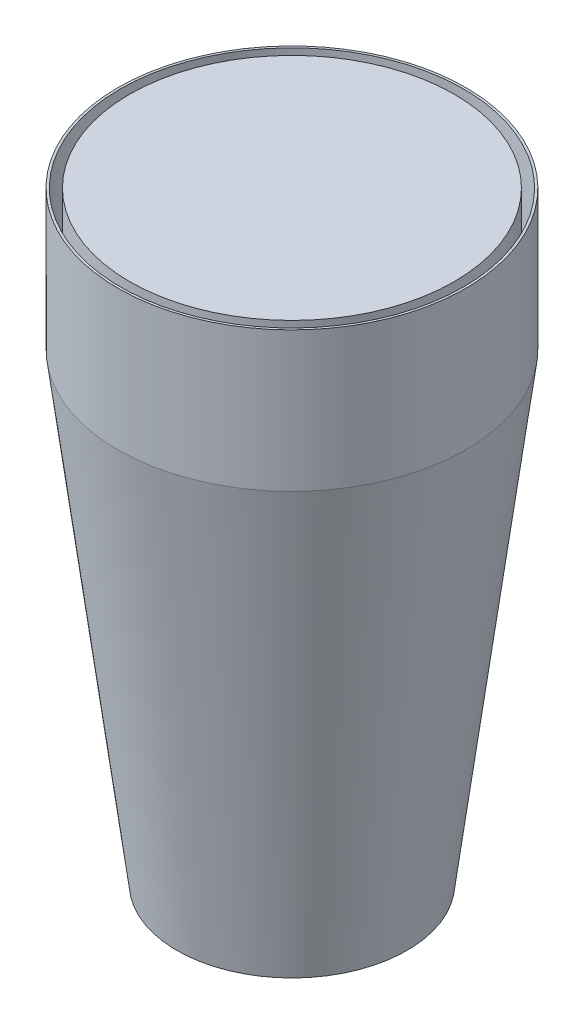
ISO-10303-21;
HEADER;
FILE_DESCRIPTION(('STEP AP214'),'2;1');
FILE_NAME('part.step','',(''),(''),'','','');
FILE_SCHEMA(('AUTOMOTIVE_DESIGN { 1 0 10303 214 1 1 1 1 }'));
ENDSEC;
DATA;
#1=APPLICATION_CONTEXT('core data for automotive mechanical design processes');
#2=APPLICATION_PROTOCOL_DEFINITION('international standard','automotive_design',2000,#1);
#3=PRODUCT_CONTEXT('',#1,'mechanical');
#4=PRODUCT('Part','Part','',(#3));
#5=PRODUCT_RELATED_PRODUCT_CATEGORY('part','',(#4));
#6=PRODUCT_DEFINITION_FORMATION('','',#4);
#7=PRODUCT_DEFINITION_CONTEXT('part definition',#1,'design');
#8=PRODUCT_DEFINITION('design','',#6,#7);
#9=PRODUCT_DEFINITION_SHAPE('','',#8);
#10=(LENGTH_UNIT() NAMED_UNIT(*) SI_UNIT(.MILLI.,.METRE.));
#11=(NAMED_UNIT(*) PLANE_ANGLE_UNIT() SI_UNIT($,.RADIAN.));
#12=(NAMED_UNIT(*) SI_UNIT($,.STERADIAN.) SOLID_ANGLE_UNIT());
#13=UNCERTAINTY_MEASURE_WITH_UNIT(LENGTH_MEASURE(1.E-05),#10,'distance_accuracy_value','');
#14=(GEOMETRIC_REPRESENTATION_CONTEXT(3) GLOBAL_UNCERTAINTY_ASSIGNED_CONTEXT((#13)) GLOBAL_UNIT_ASSIGNED_CONTEXT((#10,
#11,#12)) REPRESENTATION_CONTEXT('',''));
#15=CARTESIAN_POINT('',(0.,0.,0.));
#16=DIRECTION('',(0.,0.,1.));
#17=DIRECTION('',(1.,0.,0.));
#18=AXIS2_PLACEMENT_3D('',#15,#16,#17);
#19=CARTESIAN_POINT('',(74.,260.,0.));
#20=DIRECTION('',(0.,-1.,0.));
#21=DIRECTION('',(1.,0.,0.));
#22=AXIS2_PLACEMENT_3D('',#19,#20,#21);
#23=PLANE('',#22);
#24=CARTESIAN_POINT('',(0.,260.,0.));
#25=DIRECTION('',(0.,1.,0.));
#26=DIRECTION('',(-1.,0.,0.));
#27=AXIS2_PLACEMENT_3D('',#24,#25,#26);
#28=CIRCLE('',#27,74.);
#29=CARTESIAN_POINT('',(-74.,260.,0.));
#30=VERTEX_POINT('',#29);
#31=EDGE_CURVE('E73',#30,#30,#28,.T.);
#32=ORIENTED_EDGE('',*,*,#31,.F.);
#33=EDGE_LOOP('',(#32));
#34=FACE_BOUND('',#33,.T.);
#35=CARTESIAN_POINT('',(0.,260.,0.));
#36=DIRECTION('',(0.,1.,0.));
#37=DIRECTION('',(-1.,0.,0.));
#38=AXIS2_PLACEMENT_3D('',#35,#36,#37);
#39=CIRCLE('',#38,75.);
#40=CARTESIAN_POINT('',(-75.,260.,0.));
#41=VERTEX_POINT('',#40);
#42=EDGE_CURVE('E11',#41,#41,#39,.T.);
#43=ORIENTED_EDGE('',*,*,#42,.T.);
#44=EDGE_LOOP('',(#43));
#45=FACE_BOUND('',#44,.T.);
#46=ADVANCED_FACE('F51',(#34,#45),#23,.F.);
#47=CARTESIAN_POINT('',(0.,260.,0.));
#48=DIRECTION('',(0.,1.,0.));
#49=DIRECTION('',(-1.,0.,0.));
#50=AXIS2_PLACEMENT_3D('',#47,#48,#49);
#51=CYLINDRICAL_SURFACE('',#50,75.);
#52=ORIENTED_EDGE('',*,*,#42,.F.);
#53=EDGE_LOOP('',(#52));
#54=FACE_BOUND('',#53,.T.);
#55=CARTESIAN_POINT('',(0.,199.683748808049,0.));
#56=DIRECTION('',(0.,1.,0.));
#57=DIRECTION('',(-1.,0.,0.));
#58=AXIS2_PLACEMENT_3D('',#55,#56,#57);
#59=CIRCLE('',#58,75.);
#60=CARTESIAN_POINT('',(-75.,199.683748808049,0.));
#61=VERTEX_POINT('',#60);
#62=EDGE_CURVE('E57',#61,#61,#59,.T.);
#63=ORIENTED_EDGE('',*,*,#62,.T.);
#64=EDGE_LOOP('',(#63));
#65=FACE_BOUND('',#64,.T.);
#66=ADVANCED_FACE('F80',(#54,#65),#51,.T.);
#67=CARTESIAN_POINT('',(0.,0.,0.));
#68=DIRECTION('',(0.,1.,0.));
#69=DIRECTION('',(-1.,0.,0.));
#70=AXIS2_PLACEMENT_3D('',#67,#68,#69);
#71=CONICAL_SURFACE('',#70,49.6384493371592,0.126332188255514);
#72=ORIENTED_EDGE('',*,*,#62,.F.);
#73=EDGE_LOOP('',(#72));
#74=FACE_BOUND('',#73,.T.);
#75=CARTESIAN_POINT('',(0.,0.,0.));
#76=DIRECTION('',(0.,1.,0.));
#77=DIRECTION('',(-1.,0.,0.));
#78=AXIS2_PLACEMENT_3D('',#75,#76,#77);
#79=CIRCLE('',#78,49.6384493371592);
#80=CARTESIAN_POINT('',(-49.6384493371592,0.,0.));
#81=VERTEX_POINT('',#80);
#82=EDGE_CURVE('E61',#81,#81,#79,.T.);
#83=ORIENTED_EDGE('',*,*,#82,.T.);
#84=EDGE_LOOP('',(#83));
#85=FACE_BOUND('',#84,.T.);
#86=ADVANCED_FACE('F84',(#74,#85),#71,.T.);
#87=CARTESIAN_POINT('',(48.6304160137919,0.,0.));
#88=DIRECTION('',(0.,1.,0.));
#89=DIRECTION('',(-1.,0.,0.));
#90=AXIS2_PLACEMENT_3D('',#87,#88,#89);
#91=PLANE('',#90);
#92=ORIENTED_EDGE('',*,*,#82,.F.);
#93=EDGE_LOOP('',(#92));
#94=FACE_BOUND('',#93,.T.);
#95=CARTESIAN_POINT('',(0.,0.,0.));
#96=DIRECTION('',(0.,1.,0.));
#97=DIRECTION('',(-1.,0.,0.));
#98=AXIS2_PLACEMENT_3D('',#95,#96,#97);
#99=CIRCLE('',#98,48.6304160137919);
#100=CARTESIAN_POINT('',(-48.6304160137919,0.,0.));
#101=VERTEX_POINT('',#100);
#102=EDGE_CURVE('E65',#101,#101,#99,.T.);
#103=ORIENTED_EDGE('',*,*,#102,.T.);
#104=EDGE_LOOP('',(#103));
#105=FACE_BOUND('',#104,.T.);
#106=ADVANCED_FACE('F89',(#94,#105),#91,.F.);
#107=CARTESIAN_POINT('',(0.,199.746999046439,0.));
#108=DIRECTION('',(0.,1.,0.));
#109=DIRECTION('',(-1.,0.,0.));
#110=AXIS2_PLACEMENT_3D('',#107,#108,#109);
#111=CONICAL_SURFACE('',#110,74.,0.126332188255514);
#112=ORIENTED_EDGE('',*,*,#102,.F.);
#113=EDGE_LOOP('',(#112));
#114=FACE_BOUND('',#113,.T.);
#115=CARTESIAN_POINT('',(0.,199.746999046439,0.));
#116=DIRECTION('',(0.,1.,0.));
#117=DIRECTION('',(-1.,0.,0.));
#118=AXIS2_PLACEMENT_3D('',#115,#116,#117);
#119=CIRCLE('',#118,74.);
#120=CARTESIAN_POINT('',(-74.,199.746999046439,0.));
#121=VERTEX_POINT('',#120);
#122=EDGE_CURVE('E70',#121,#121,#119,.T.);
#123=ORIENTED_EDGE('',*,*,#122,.T.);
#124=EDGE_LOOP('',(#123));
#125=FACE_BOUND('',#124,.T.);
#126=ADVANCED_FACE('F95',(#114,#125),#111,.F.);
#127=CARTESIAN_POINT('',(0.,260.,0.));
#128=DIRECTION('',(0.,1.,0.));
#129=DIRECTION('',(-1.,0.,0.));
#130=AXIS2_PLACEMENT_3D('',#127,#128,#129);
#131=CYLINDRICAL_SURFACE('',#130,74.);
#132=ORIENTED_EDGE('',*,*,#122,.F.);
#133=EDGE_LOOP('',(#132));
#134=FACE_BOUND('',#133,.T.);
#135=ORIENTED_EDGE('',*,*,#31,.T.);
#136=EDGE_LOOP('',(#135));
#137=FACE_BOUND('',#136,.T.);
#138=ADVANCED_FACE('F77',(#134,#137),#131,.F.);
#139=CLOSED_SHELL('',(#46,#66,#86,#106,#126,#138));
#140=MANIFOLD_SOLID_BREP('B2',#139);
#141=CARTESIAN_POINT('',(0.,0.,0.));
#142=DIRECTION('',(0.,1.,0.));
#143=DIRECTION('',(-1.,0.,0.));
#144=AXIS2_PLACEMENT_3D('',#141,#142,#143);
#145=PLANE('',#144);
#146=CARTESIAN_POINT('',(0.,0.,0.));
#147=DIRECTION('',(0.,1.,0.));
#148=DIRECTION('',(-1.,0.,0.));
#149=AXIS2_PLACEMENT_3D('',#146,#147,#148);
#150=CIRCLE('',#149,45.);
#151=CARTESIAN_POINT('',(-45.,0.,0.));
#152=VERTEX_POINT('',#151);
#153=EDGE_CURVE('E50',#152,#152,#150,.T.);
#154=ORIENTED_EDGE('',*,*,#153,.F.);
#155=EDGE_LOOP('',(#154));
#156=FACE_BOUND('',#155,.T.);
#157=ADVANCED_FACE('F155',(#156),#145,.F.);
#158=CARTESIAN_POINT('',(0.,260.,0.));
#159=DIRECTION('',(0.,1.,0.));
#160=DIRECTION('',(-1.,0.,0.));
#161=AXIS2_PLACEMENT_3D('',#158,#159,#160);
#162=CYLINDRICAL_SURFACE('',#161,45.);
#163=CARTESIAN_POINT('',(0.,200.,0.));
#164=DIRECTION('',(0.,1.,0.));
#165=DIRECTION('',(-1.,0.,0.));
#166=AXIS2_PLACEMENT_3D('',#163,#164,#165);
#167=CIRCLE('',#166,45.);
#168=CARTESIAN_POINT('',(-45.,200.,0.));
#169=VERTEX_POINT('',#168);
#170=EDGE_CURVE('E162',#169,#169,#167,.T.);
#171=ORIENTED_EDGE('',*,*,#170,.F.);
#172=EDGE_LOOP('',(#171));
#173=FACE_BOUND('',#172,.T.);
#174=ORIENTED_EDGE('',*,*,#153,.T.);
#175=EDGE_LOOP('',(#174));
#176=FACE_BOUND('',#175,.T.);
#177=ADVANCED_FACE('F189',(#173,#176),#162,.T.);
#178=CARTESIAN_POINT('',(45.,200.,0.));
#179=DIRECTION('',(0.,1.,0.));
#180=DIRECTION('',(-1.,0.,0.));
#181=AXIS2_PLACEMENT_3D('',#178,#179,#180);
#182=PLANE('',#181);
#183=CARTESIAN_POINT('',(0.,200.,0.));
#184=DIRECTION('',(0.,1.,0.));
#185=DIRECTION('',(-1.,0.,0.));
#186=AXIS2_PLACEMENT_3D('',#183,#184,#185);
#187=CIRCLE('',#186,70.);
#188=CARTESIAN_POINT('',(-70.,200.,0.));
#189=VERTEX_POINT('',#188);
#190=EDGE_CURVE('E167',#189,#189,#187,.T.);
#191=ORIENTED_EDGE('',*,*,#190,.F.);
#192=EDGE_LOOP('',(#191));
#193=FACE_BOUND('',#192,.T.);
#194=ORIENTED_EDGE('',*,*,#170,.T.);
#195=EDGE_LOOP('',(#194));
#196=FACE_BOUND('',#195,.T.);
#197=ADVANCED_FACE('F184',(#193,#196),#182,.F.);
#198=CARTESIAN_POINT('',(0.,260.,0.));
#199=DIRECTION('',(0.,1.,0.));
#200=DIRECTION('',(-1.,0.,0.));
#201=AXIS2_PLACEMENT_3D('',#198,#199,#200);
#202=CYLINDRICAL_SURFACE('',#201,70.);
#203=CARTESIAN_POINT('',(0.,260.,0.));
#204=DIRECTION('',(0.,1.,0.));
#205=DIRECTION('',(-1.,0.,0.));
#206=AXIS2_PLACEMENT_3D('',#203,#204,#205);
#207=CIRCLE('',#206,70.);
#208=CARTESIAN_POINT('',(-70.,260.,0.));
#209=VERTEX_POINT('',#208);
#210=EDGE_CURVE('E172',#209,#209,#207,.T.);
#211=ORIENTED_EDGE('',*,*,#210,.F.);
#212=EDGE_LOOP('',(#211));
#213=FACE_BOUND('',#212,.T.);
#214=ORIENTED_EDGE('',*,*,#190,.T.);
#215=EDGE_LOOP('',(#214));
#216=FACE_BOUND('',#215,.T.);
#217=ADVANCED_FACE('F181',(#213,#216),#202,.T.);
#218=CARTESIAN_POINT('',(70.,260.,0.));
#219=DIRECTION('',(0.,-1.,0.));
#220=DIRECTION('',(1.,0.,0.));
#221=AXIS2_PLACEMENT_3D('',#218,#219,#220);
#222=PLANE('',#221);
#223=ORIENTED_EDGE('',*,*,#210,.T.);
#224=EDGE_LOOP('',(#223));
#225=FACE_BOUND('',#224,.T.);
#226=ADVANCED_FACE('F179',(#225),#222,.F.);
#227=CLOSED_SHELL('',(#157,#177,#197,#217,#226));
#228=MANIFOLD_SOLID_BREP('B6_NOT_SHOWN',#227);
#229=ADVANCED_BREP_SHAPE_REPRESENTATION('',(#18,#140,#228),#14);
#230=SHAPE_DEFINITION_REPRESENTATION(#9,#229);
ENDSEC;
END-ISO-10303-21;
